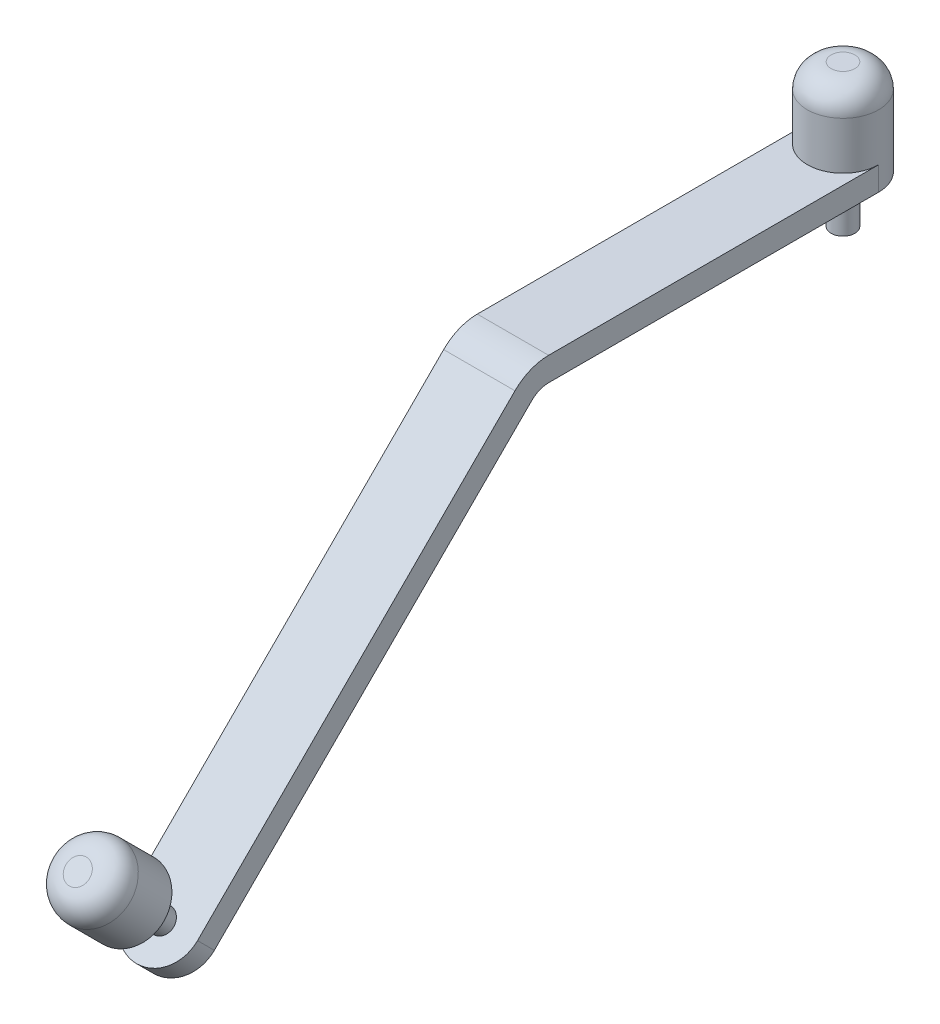
ISO-10303-21;
HEADER;
FILE_DESCRIPTION(('STEP AP214'),'2;1');
FILE_NAME('part.step','',(''),(''),'','','');
FILE_SCHEMA(('AUTOMOTIVE_DESIGN { 1 0 10303 214 1 1 1 1 }'));
ENDSEC;
DATA;
#1=APPLICATION_CONTEXT('core data for automotive mechanical design processes');
#2=APPLICATION_PROTOCOL_DEFINITION('international standard','automotive_design',2000,#1);
#3=PRODUCT_CONTEXT('',#1,'mechanical');
#4=PRODUCT('Part','Part','',(#3));
#5=PRODUCT_RELATED_PRODUCT_CATEGORY('part','',(#4));
#6=PRODUCT_DEFINITION_FORMATION('','',#4);
#7=PRODUCT_DEFINITION_CONTEXT('part definition',#1,'design');
#8=PRODUCT_DEFINITION('design','',#6,#7);
#9=PRODUCT_DEFINITION_SHAPE('','',#8);
#10=(LENGTH_UNIT() NAMED_UNIT(*) SI_UNIT(.MILLI.,.METRE.));
#11=(NAMED_UNIT(*) PLANE_ANGLE_UNIT() SI_UNIT($,.RADIAN.));
#12=(NAMED_UNIT(*) SI_UNIT($,.STERADIAN.) SOLID_ANGLE_UNIT());
#13=UNCERTAINTY_MEASURE_WITH_UNIT(LENGTH_MEASURE(1.E-05),#10,'distance_accuracy_value','');
#14=(GEOMETRIC_REPRESENTATION_CONTEXT(3) GLOBAL_UNCERTAINTY_ASSIGNED_CONTEXT((#13)) GLOBAL_UNIT_ASSIGNED_CONTEXT((#10,
#11,#12)) REPRESENTATION_CONTEXT('',''));
#15=CARTESIAN_POINT('',(0.,0.,0.));
#16=DIRECTION('',(0.,0.,1.));
#17=DIRECTION('',(1.,0.,0.));
#18=AXIS2_PLACEMENT_3D('',#15,#16,#17);
#19=CARTESIAN_POINT('',(30.,43.5355339059328,43.5355339059328));
#20=DIRECTION('',(0.,0.707106781186547,0.707106781186548));
#21=DIRECTION('',(0.,-0.707106781186548,0.707106781186547));
#22=AXIS2_PLACEMENT_3D('',#19,#20,#21);
#23=PLANE('',#22);
#24=CARTESIAN_POINT('',(15.,-134.350288425443,221.421356237308));
#25=DIRECTION('',(0.,0.707106781186547,0.707106781186548));
#26=DIRECTION('',(0.,-0.707106781186548,0.707106781186547));
#27=AXIS2_PLACEMENT_3D('',#24,#25,#26);
#28=CIRCLE('',#27,5.00000000000001);
#29=CARTESIAN_POINT('',(15.,-137.885822331375,224.956890143241));
#30=VERTEX_POINT('',#29);
#31=EDGE_CURVE('E130',#30,#30,#28,.T.);
#32=ORIENTED_EDGE('',*,*,#31,.F.);
#33=EDGE_LOOP('',(#32));
#34=FACE_BOUND('',#33,.T.);
#35=CARTESIAN_POINT('',(15.,-134.350288425443,221.421356237308));
#36=DIRECTION('',(0.,0.707106781186547,0.707106781186548));
#37=DIRECTION('',(0.,-0.707106781186548,0.707106781186547));
#38=AXIS2_PLACEMENT_3D('',#35,#36,#37);
#39=CIRCLE('',#38,15.);
#40=CARTESIAN_POINT('',(0.,-134.350288425443,221.421356237308));
#41=VERTEX_POINT('',#40);
#42=CARTESIAN_POINT('',(15.,-144.956890143241,232.027957955106));
#43=VERTEX_POINT('',#42);
#44=EDGE_CURVE('E436',#41,#43,#39,.T.);
#45=ORIENTED_EDGE('',*,*,#44,.T.);
#46=CARTESIAN_POINT('',(15.,-134.350288425443,221.421356237308));
#47=DIRECTION('',(0.,0.707106781186547,0.707106781186548));
#48=DIRECTION('',(0.,-0.707106781186548,0.707106781186547));
#49=AXIS2_PLACEMENT_3D('',#46,#47,#48);
#50=CIRCLE('',#49,15.);
#51=CARTESIAN_POINT('',(30.,-134.350288425443,221.421356237308));
#52=VERTEX_POINT('',#51);
#53=EDGE_CURVE('E438',#43,#52,#50,.T.);
#54=ORIENTED_EDGE('',*,*,#53,.T.);
#55=DIRECTION('',(0.,0.707106781186548,-0.707106781186547));
#56=VECTOR('',#55,1.);
#57=CARTESIAN_POINT('',(30.,43.5355339059328,43.5355339059328));
#58=LINE('',#57,#56);
#59=CARTESIAN_POINT('',(30.,-0.857864376269064,87.9289321881346));
#60=VERTEX_POINT('',#59);
#61=EDGE_CURVE('E390',#52,#60,#58,.T.);
#62=ORIENTED_EDGE('',*,*,#61,.T.);
#63=DIRECTION('',(-1.,0.,0.));
#64=VECTOR('',#63,1.);
#65=CARTESIAN_POINT('',(30.,-0.857864376269057,87.9289321881346));
#66=LINE('',#65,#64);
#67=CARTESIAN_POINT('',(0.,-0.857864376269064,87.9289321881346));
#68=VERTEX_POINT('',#67);
#69=EDGE_CURVE('E419',#60,#68,#66,.T.);
#70=ORIENTED_EDGE('',*,*,#69,.T.);
#71=DIRECTION('',(0.,0.707106781186548,-0.707106781186547));
#72=VECTOR('',#71,1.);
#73=CARTESIAN_POINT('',(0.,43.5355339059328,43.5355339059328));
#74=LINE('',#73,#72);
#75=EDGE_CURVE('E127',#41,#68,#74,.T.);
#76=ORIENTED_EDGE('',*,*,#75,.F.);
#77=EDGE_LOOP('',(#45,#54,#62,#70,#76));
#78=FACE_BOUND('',#77,.T.);
#79=ADVANCED_FACE('F41',(#34,#78),#23,.T.);
#80=CARTESIAN_POINT('',(30.,36.4644660940675,36.4644660940676));
#81=DIRECTION('',(0.,0.707106781186546,0.707106781186549));
#82=DIRECTION('',(0.,-0.707106781186549,0.707106781186546));
#83=AXIS2_PLACEMENT_3D('',#80,#81,#82);
#84=PLANE('',#83);
#85=DIRECTION('',(0.,0.707106781186549,-0.707106781186546));
#86=VECTOR('',#85,1.);
#87=CARTESIAN_POINT('',(30.,36.4644660940675,36.4644660940676));
#88=LINE('',#87,#86);
#89=CARTESIAN_POINT('',(30.,-141.421356237308,214.350288425443));
#90=VERTEX_POINT('',#89);
#91=CARTESIAN_POINT('',(30.,-7.92893218813455,80.8578643762695));
#92=VERTEX_POINT('',#91);
#93=EDGE_CURVE('E392',#90,#92,#88,.T.);
#94=ORIENTED_EDGE('',*,*,#93,.F.);
#95=CARTESIAN_POINT('',(15.,-141.421356237308,214.350288425443));
#96=DIRECTION('',(0.,0.707106781186546,0.707106781186549));
#97=DIRECTION('',(0.,-0.707106781186549,0.707106781186546));
#98=AXIS2_PLACEMENT_3D('',#95,#96,#97);
#99=CIRCLE('',#98,15.);
#100=CARTESIAN_POINT('',(15.,-152.027957955106,224.956890143241));
#101=VERTEX_POINT('',#100);
#102=EDGE_CURVE('E434',#90,#101,#99,.F.);
#103=ORIENTED_EDGE('',*,*,#102,.T.);
#104=CARTESIAN_POINT('',(15.,-141.421356237308,214.350288425443));
#105=DIRECTION('',(0.,0.707106781186546,0.707106781186549));
#106=DIRECTION('',(0.,-0.707106781186549,0.707106781186546));
#107=AXIS2_PLACEMENT_3D('',#104,#105,#106);
#108=CIRCLE('',#107,15.);
#109=CARTESIAN_POINT('',(0.,-141.421356237308,214.350288425443));
#110=VERTEX_POINT('',#109);
#111=EDGE_CURVE('E432',#101,#110,#108,.F.);
#112=ORIENTED_EDGE('',*,*,#111,.T.);
#113=DIRECTION('',(0.,0.707106781186549,-0.707106781186546));
#114=VECTOR('',#113,1.);
#115=CARTESIAN_POINT('',(0.,36.4644660940675,36.4644660940676));
#116=LINE('',#115,#114);
#117=CARTESIAN_POINT('',(0.,-7.92893218813455,80.8578643762695));
#118=VERTEX_POINT('',#117);
#119=EDGE_CURVE('E404',#110,#118,#116,.T.);
#120=ORIENTED_EDGE('',*,*,#119,.T.);
#121=DIRECTION('',(-1.,0.,0.));
#122=VECTOR('',#121,1.);
#123=CARTESIAN_POINT('',(30.,-7.92893218813454,80.8578643762695));
#124=LINE('',#123,#122);
#125=EDGE_CURVE('E411',#118,#92,#124,.F.);
#126=ORIENTED_EDGE('',*,*,#125,.T.);
#127=EDGE_LOOP('',(#94,#103,#112,#120,#126));
#128=FACE_BOUND('',#127,.T.);
#129=ADVANCED_FACE('F157',(#128),#84,.F.);
#130=CARTESIAN_POINT('',(30.,-5.,0.));
#131=DIRECTION('',(0.,1.,0.));
#132=DIRECTION('',(0.,0.,1.));
#133=AXIS2_PLACEMENT_3D('',#130,#131,#132);
#134=PLANE('',#133);
#135=CARTESIAN_POINT('',(15.,-5.,-65.));
#136=DIRECTION('',(0.,1.,0.));
#137=DIRECTION('',(0.,0.,1.));
#138=AXIS2_PLACEMENT_3D('',#135,#136,#137);
#139=CIRCLE('',#138,5.);
#140=CARTESIAN_POINT('',(15.,-5.,-60.));
#141=VERTEX_POINT('',#140);
#142=EDGE_CURVE('E141',#141,#141,#139,.F.);
#143=ORIENTED_EDGE('',*,*,#142,.F.);
#144=EDGE_LOOP('',(#143));
#145=FACE_BOUND('',#144,.T.);
#146=CARTESIAN_POINT('',(15.,-5.,-65.));
#147=DIRECTION('',(0.,1.,0.));
#148=DIRECTION('',(0.,0.,1.));
#149=AXIS2_PLACEMENT_3D('',#146,#147,#148);
#150=CIRCLE('',#149,15.);
#151=CARTESIAN_POINT('',(0.,-5.,-65.));
#152=VERTEX_POINT('',#151);
#153=CARTESIAN_POINT('',(15.,-5.,-80.));
#154=VERTEX_POINT('',#153);
#155=EDGE_CURVE('E56',#152,#154,#150,.F.);
#156=ORIENTED_EDGE('',*,*,#155,.T.);
#157=CARTESIAN_POINT('',(15.,-5.,-65.));
#158=DIRECTION('',(0.,1.,0.));
#159=DIRECTION('',(0.,0.,1.));
#160=AXIS2_PLACEMENT_3D('',#157,#158,#159);
#161=CIRCLE('',#160,15.);
#162=CARTESIAN_POINT('',(30.,-5.,-65.));
#163=VERTEX_POINT('',#162);
#164=EDGE_CURVE('E122',#154,#163,#161,.F.);
#165=ORIENTED_EDGE('',*,*,#164,.T.);
#166=DIRECTION('',(0.,0.,-1.));
#167=VECTOR('',#166,1.);
#168=CARTESIAN_POINT('',(30.,-5.,0.));
#169=LINE('',#168,#167);
#170=CARTESIAN_POINT('',(30.,-5.,73.786796564404));
#171=VERTEX_POINT('',#170);
#172=EDGE_CURVE('E395',#171,#163,#169,.T.);
#173=ORIENTED_EDGE('',*,*,#172,.F.);
#174=DIRECTION('',(-1.,0.,0.));
#175=VECTOR('',#174,1.);
#176=CARTESIAN_POINT('',(0.,-5.,73.786796564404));
#177=LINE('',#176,#175);
#178=CARTESIAN_POINT('',(0.,-5.,73.786796564404));
#179=VERTEX_POINT('',#178);
#180=EDGE_CURVE('E402',#171,#179,#177,.T.);
#181=ORIENTED_EDGE('',*,*,#180,.T.);
#182=DIRECTION('',(0.,0.,-1.));
#183=VECTOR('',#182,1.);
#184=CARTESIAN_POINT('',(0.,-5.,0.));
#185=LINE('',#184,#183);
#186=EDGE_CURVE('E406',#179,#152,#185,.T.);
#187=ORIENTED_EDGE('',*,*,#186,.T.);
#188=EDGE_LOOP('',(#156,#165,#173,#181,#187));
#189=FACE_BOUND('',#188,.T.);
#190=ADVANCED_FACE('F163',(#145,#189),#134,.F.);
#191=CARTESIAN_POINT('',(30.,5.,0.));
#192=DIRECTION('',(0.,1.,0.));
#193=DIRECTION('',(0.,0.,1.));
#194=AXIS2_PLACEMENT_3D('',#191,#192,#193);
#195=PLANE('',#194);
#196=DIRECTION('',(0.,0.,-1.));
#197=VECTOR('',#196,1.);
#198=CARTESIAN_POINT('',(30.,5.,0.));
#199=LINE('',#198,#197);
#200=CARTESIAN_POINT('',(30.,5.,73.7867965644036));
#201=VERTEX_POINT('',#200);
#202=CARTESIAN_POINT('',(30.,5.,-65.));
#203=VERTEX_POINT('',#202);
#204=EDGE_CURVE('E399',#201,#203,#199,.T.);
#205=ORIENTED_EDGE('',*,*,#204,.T.);
#206=CARTESIAN_POINT('',(15.,5.,-65.));
#207=DIRECTION('',(0.,1.,0.));
#208=DIRECTION('',(0.,0.,1.));
#209=AXIS2_PLACEMENT_3D('',#206,#207,#208);
#210=CIRCLE('',#209,15.);
#211=CARTESIAN_POINT('',(0.,5.,-65.));
#212=VERTEX_POINT('',#211);
#213=EDGE_CURVE('E381',#212,#203,#210,.T.);
#214=ORIENTED_EDGE('',*,*,#213,.F.);
#215=DIRECTION('',(0.,0.,-1.));
#216=VECTOR('',#215,1.);
#217=CARTESIAN_POINT('',(0.,5.,0.));
#218=LINE('',#217,#216);
#219=CARTESIAN_POINT('',(0.,5.,73.7867965644036));
#220=VERTEX_POINT('',#219);
#221=EDGE_CURVE('E393',#220,#212,#218,.T.);
#222=ORIENTED_EDGE('',*,*,#221,.F.);
#223=DIRECTION('',(-1.,0.,0.));
#224=VECTOR('',#223,1.);
#225=CARTESIAN_POINT('',(30.,5.,73.7867965644036));
#226=LINE('',#225,#224);
#227=EDGE_CURVE('E424',#220,#201,#226,.F.);
#228=ORIENTED_EDGE('',*,*,#227,.T.);
#229=EDGE_LOOP('',(#205,#214,#222,#228));
#230=FACE_BOUND('',#229,.T.);
#231=ADVANCED_FACE('F224',(#230),#195,.T.);
#232=CARTESIAN_POINT('',(30.,0.,0.));
#233=DIRECTION('',(1.,0.,0.));
#234=DIRECTION('',(0.,0.,-1.));
#235=AXIS2_PLACEMENT_3D('',#232,#233,#234);
#236=PLANE('',#235);
#237=ORIENTED_EDGE('',*,*,#172,.T.);
#238=DIRECTION('',(0.,1.,0.));
#239=VECTOR('',#238,1.);
#240=CARTESIAN_POINT('',(30.,5.,-65.));
#241=LINE('',#240,#239);
#242=EDGE_CURVE('E441',#163,#203,#241,.T.);
#243=ORIENTED_EDGE('',*,*,#242,.T.);
#244=ORIENTED_EDGE('',*,*,#204,.F.);
#245=CARTESIAN_POINT('',(30.,-15.,73.7867965644036));
#246=DIRECTION('',(1.,0.,0.));
#247=DIRECTION('',(0.,0.,-1.));
#248=AXIS2_PLACEMENT_3D('',#245,#246,#247);
#249=CIRCLE('',#248,20.);
#250=EDGE_CURVE('E426',#201,#60,#249,.T.);
#251=ORIENTED_EDGE('',*,*,#250,.T.);
#252=ORIENTED_EDGE('',*,*,#61,.F.);
#253=DIRECTION('',(0.,-0.707106781186545,-0.70710678118655));
#254=VECTOR('',#253,1.);
#255=CARTESIAN_POINT('',(30.,-141.421356237308,214.350288425443));
#256=LINE('',#255,#254);
#257=EDGE_CURVE('E429',#52,#90,#256,.T.);
#258=ORIENTED_EDGE('',*,*,#257,.T.);
#259=ORIENTED_EDGE('',*,*,#93,.T.);
#260=CARTESIAN_POINT('',(30.,-15.,73.786796564404));
#261=DIRECTION('',(1.,0.,0.));
#262=DIRECTION('',(0.,0.,-1.));
#263=AXIS2_PLACEMENT_3D('',#260,#261,#262);
#264=CIRCLE('',#263,10.);
#265=EDGE_CURVE('E417',#92,#171,#264,.F.);
#266=ORIENTED_EDGE('',*,*,#265,.T.);
#267=EDGE_LOOP('',(#237,#243,#244,#251,#252,#258,#259,#266));
#268=FACE_BOUND('',#267,.T.);
#269=ADVANCED_FACE('F221',(#268),#236,.T.);
#270=CARTESIAN_POINT('',(0.,0.,0.));
#271=DIRECTION('',(1.,0.,0.));
#272=DIRECTION('',(0.,0.,-1.));
#273=AXIS2_PLACEMENT_3D('',#270,#271,#272);
#274=PLANE('',#273);
#275=ORIENTED_EDGE('',*,*,#221,.T.);
#276=DIRECTION('',(0.,1.,0.));
#277=VECTOR('',#276,1.);
#278=CARTESIAN_POINT('',(0.,0.,-65.));
#279=LINE('',#278,#277);
#280=EDGE_CURVE('E64',#212,#152,#279,.F.);
#281=ORIENTED_EDGE('',*,*,#280,.T.);
#282=ORIENTED_EDGE('',*,*,#186,.F.);
#283=CARTESIAN_POINT('',(0.,-15.,73.786796564404));
#284=DIRECTION('',(1.,0.,0.));
#285=DIRECTION('',(0.,0.,-1.));
#286=AXIS2_PLACEMENT_3D('',#283,#284,#285);
#287=CIRCLE('',#286,10.);
#288=EDGE_CURVE('E414',#179,#118,#287,.T.);
#289=ORIENTED_EDGE('',*,*,#288,.T.);
#290=ORIENTED_EDGE('',*,*,#119,.F.);
#291=DIRECTION('',(0.,-0.707106781186545,-0.70710678118655));
#292=VECTOR('',#291,1.);
#293=CARTESIAN_POINT('',(0.,-177.885822331376,177.885822331374));
#294=LINE('',#293,#292);
#295=EDGE_CURVE('E440',#110,#41,#294,.F.);
#296=ORIENTED_EDGE('',*,*,#295,.T.);
#297=ORIENTED_EDGE('',*,*,#75,.T.);
#298=CARTESIAN_POINT('',(0.,-15.,73.7867965644036));
#299=DIRECTION('',(1.,0.,0.));
#300=DIRECTION('',(0.,0.,-1.));
#301=AXIS2_PLACEMENT_3D('',#298,#299,#300);
#302=CIRCLE('',#301,20.);
#303=EDGE_CURVE('E422',#68,#220,#302,.F.);
#304=ORIENTED_EDGE('',*,*,#303,.T.);
#305=EDGE_LOOP('',(#275,#281,#282,#289,#290,#296,#297,#304));
#306=FACE_BOUND('',#305,.T.);
#307=ADVANCED_FACE('F174',(#306),#274,.F.);
#308=CARTESIAN_POINT('',(30.,-15.,73.786796564404));
#309=DIRECTION('',(1.,0.,0.));
#310=DIRECTION('',(0.,0.,-1.));
#311=AXIS2_PLACEMENT_3D('',#308,#309,#310);
#312=CYLINDRICAL_SURFACE('',#311,10.);
#313=ORIENTED_EDGE('',*,*,#265,.F.);
#314=ORIENTED_EDGE('',*,*,#125,.F.);
#315=ORIENTED_EDGE('',*,*,#288,.F.);
#316=ORIENTED_EDGE('',*,*,#180,.F.);
#317=EDGE_LOOP('',(#313,#314,#315,#316));
#318=FACE_BOUND('',#317,.T.);
#319=ADVANCED_FACE('F170',(#318),#312,.F.);
#320=CARTESIAN_POINT('',(30.,-15.,73.7867965644036));
#321=DIRECTION('',(-1.,0.,0.));
#322=DIRECTION('',(0.,0.,1.));
#323=AXIS2_PLACEMENT_3D('',#320,#321,#322);
#324=CYLINDRICAL_SURFACE('',#323,20.);
#325=ORIENTED_EDGE('',*,*,#250,.F.);
#326=ORIENTED_EDGE('',*,*,#227,.F.);
#327=ORIENTED_EDGE('',*,*,#303,.F.);
#328=ORIENTED_EDGE('',*,*,#69,.F.);
#329=EDGE_LOOP('',(#325,#326,#327,#328));
#330=FACE_BOUND('',#329,.T.);
#331=ADVANCED_FACE('F173',(#330),#324,.T.);
#332=CARTESIAN_POINT('',(15.,-177.885822331376,177.885822331374));
#333=DIRECTION('',(0.,-0.707106781186545,-0.70710678118655));
#334=DIRECTION('',(0.,0.70710678118655,-0.707106781186545));
#335=AXIS2_PLACEMENT_3D('',#332,#333,#334);
#336=CYLINDRICAL_SURFACE('',#335,15.);
#337=DIRECTION('',(0.,-0.707106781186545,-0.70710678118655));
#338=VECTOR('',#337,1.);
#339=CARTESIAN_POINT('',(15.,-188.492424049174,188.492424049173));
#340=LINE('',#339,#338);
#341=EDGE_CURVE('E123',#43,#101,#340,.T.);
#342=ORIENTED_EDGE('',*,*,#341,.F.);
#343=ORIENTED_EDGE('',*,*,#44,.F.);
#344=ORIENTED_EDGE('',*,*,#295,.F.);
#345=ORIENTED_EDGE('',*,*,#111,.F.);
#346=EDGE_LOOP('',(#342,#343,#344,#345));
#347=FACE_BOUND('',#346,.T.);
#348=ADVANCED_FACE('F178',(#347),#336,.T.);
#349=CARTESIAN_POINT('',(15.,-177.885822331376,177.885822331374));
#350=DIRECTION('',(0.,0.707106781186545,0.70710678118655));
#351=DIRECTION('',(0.,-0.70710678118655,0.707106781186545));
#352=AXIS2_PLACEMENT_3D('',#349,#350,#351);
#353=CYLINDRICAL_SURFACE('',#352,15.);
#354=ORIENTED_EDGE('',*,*,#53,.F.);
#355=ORIENTED_EDGE('',*,*,#341,.T.);
#356=ORIENTED_EDGE('',*,*,#102,.F.);
#357=ORIENTED_EDGE('',*,*,#257,.F.);
#358=EDGE_LOOP('',(#354,#355,#356,#357));
#359=FACE_BOUND('',#358,.T.);
#360=ADVANCED_FACE('F180',(#359),#353,.T.);
#361=CARTESIAN_POINT('',(15.,0.,-65.));
#362=DIRECTION('',(0.,1.,0.));
#363=DIRECTION('',(0.,0.,1.));
#364=AXIS2_PLACEMENT_3D('',#361,#362,#363);
#365=CYLINDRICAL_SURFACE('',#364,15.);
#366=CARTESIAN_POINT('',(15.,25.,-65.));
#367=DIRECTION('',(0.,1.,0.));
#368=DIRECTION('',(0.,0.,1.));
#369=AXIS2_PLACEMENT_3D('',#366,#367,#368);
#370=CIRCLE('',#369,15.);
#371=CARTESIAN_POINT('',(15.,25.,-50.));
#372=VERTEX_POINT('',#371);
#373=EDGE_CURVE('E11',#372,#372,#370,.F.);
#374=ORIENTED_EDGE('',*,*,#373,.T.);
#375=EDGE_LOOP('',(#374));
#376=FACE_BOUND('',#375,.T.);
#377=DIRECTION('',(0.,1.,0.));
#378=VECTOR('',#377,1.);
#379=CARTESIAN_POINT('',(15.,0.,-80.));
#380=LINE('',#379,#378);
#381=CARTESIAN_POINT('',(15.,5.,-80.));
#382=VERTEX_POINT('',#381);
#383=EDGE_CURVE('E119',#154,#382,#380,.T.);
#384=ORIENTED_EDGE('',*,*,#383,.F.);
#385=ORIENTED_EDGE('',*,*,#155,.F.);
#386=ORIENTED_EDGE('',*,*,#280,.F.);
#387=ORIENTED_EDGE('',*,*,#213,.T.);
#388=ORIENTED_EDGE('',*,*,#242,.F.);
#389=ORIENTED_EDGE('',*,*,#164,.F.);
#390=ORIENTED_EDGE('',*,*,#383,.T.);
#391=EDGE_LOOP('',(#384,#385,#386,#387,#388,#389,#390));
#392=FACE_BOUND('',#391,.T.);
#393=ADVANCED_FACE('F120',(#376,#392),#365,.T.);
#394=CARTESIAN_POINT('',(15.,-120.208152801712,235.563491861039));
#395=DIRECTION('',(0.,-0.707106781186547,-0.707106781186548));
#396=DIRECTION('',(0.,0.707106781186548,-0.707106781186547));
#397=AXIS2_PLACEMENT_3D('',#394,#395,#396);
#398=CYLINDRICAL_SURFACE('',#397,5.00000000000001);
#399=CARTESIAN_POINT('',(15.,-120.208152801712,235.563491861039));
#400=DIRECTION('',(0.,0.707106781186547,0.707106781186548));
#401=DIRECTION('',(0.,-0.707106781186548,0.707106781186547));
#402=AXIS2_PLACEMENT_3D('',#399,#400,#401);
#403=CIRCLE('',#402,5.00000000000001);
#404=CARTESIAN_POINT('',(15.,-123.743686707644,239.099025766972));
#405=VERTEX_POINT('',#404);
#406=EDGE_CURVE('E124',#405,#405,#403,.T.);
#407=ORIENTED_EDGE('',*,*,#406,.F.);
#408=EDGE_LOOP('',(#407));
#409=FACE_BOUND('',#408,.T.);
#410=ORIENTED_EDGE('',*,*,#31,.T.);
#411=EDGE_LOOP('',(#410));
#412=FACE_BOUND('',#411,.T.);
#413=ADVANCED_FACE('F188',(#409,#412),#398,.T.);
#414=CARTESIAN_POINT('',(15.,-98.9949493661153,256.776695296635));
#415=DIRECTION('',(0.,-0.707106781186547,-0.707106781186548));
#416=DIRECTION('',(0.,0.707106781186548,-0.707106781186547));
#417=AXIS2_PLACEMENT_3D('',#414,#415,#416);
#418=CYLINDRICAL_SURFACE('',#417,15.);
#419=CARTESIAN_POINT('',(15.,-106.066017177981,249.70562748477));
#420=DIRECTION('',(0.,0.707106781186547,0.707106781186548));
#421=DIRECTION('',(0.,-0.707106781186548,0.707106781186547));
#422=AXIS2_PLACEMENT_3D('',#419,#420,#421);
#423=CIRCLE('',#422,15.);
#424=CARTESIAN_POINT('',(15.,-116.672618895779,260.312229202568));
#425=VERTEX_POINT('',#424);
#426=EDGE_CURVE('E138',#425,#425,#423,.F.);
#427=ORIENTED_EDGE('',*,*,#426,.T.);
#428=EDGE_LOOP('',(#427));
#429=FACE_BOUND('',#428,.T.);
#430=CARTESIAN_POINT('',(15.,-120.208152801712,235.563491861039));
#431=DIRECTION('',(0.,0.707106781186547,0.707106781186548));
#432=DIRECTION('',(0.,-0.707106781186548,0.707106781186547));
#433=AXIS2_PLACEMENT_3D('',#430,#431,#432);
#434=CIRCLE('',#433,15.);
#435=CARTESIAN_POINT('',(15.,-130.81475451951,246.170093578837));
#436=VERTEX_POINT('',#435);
#437=EDGE_CURVE('E380',#436,#436,#434,.T.);
#438=ORIENTED_EDGE('',*,*,#437,.T.);
#439=EDGE_LOOP('',(#438));
#440=FACE_BOUND('',#439,.T.);
#441=ADVANCED_FACE('F209',(#429,#440),#418,.T.);
#442=CARTESIAN_POINT('',(15.,-98.9949493661153,256.776695296635));
#443=DIRECTION('',(0.,0.707106781186547,0.707106781186548));
#444=DIRECTION('',(0.,-0.707106781186548,0.707106781186547));
#445=AXIS2_PLACEMENT_3D('',#442,#443,#444);
#446=PLANE('',#445);
#447=CARTESIAN_POINT('',(15.,-98.9949493661153,256.776695296635));
#448=DIRECTION('',(0.,0.707106781186547,0.707106781186548));
#449=DIRECTION('',(0.,-0.707106781186548,0.707106781186547));
#450=AXIS2_PLACEMENT_3D('',#447,#448,#449);
#451=CIRCLE('',#450,4.99999999999997);
#452=CARTESIAN_POINT('',(15.,-102.530483272048,260.312229202568));
#453=VERTEX_POINT('',#452);
#454=EDGE_CURVE('E135',#453,#453,#451,.T.);
#455=ORIENTED_EDGE('',*,*,#454,.T.);
#456=EDGE_LOOP('',(#455));
#457=FACE_BOUND('',#456,.T.);
#458=ADVANCED_FACE('F201',(#457),#446,.T.);
#459=CARTESIAN_POINT('',(15.,-120.208152801712,235.563491861039));
#460=DIRECTION('',(0.,0.707106781186547,0.707106781186548));
#461=DIRECTION('',(0.,-0.707106781186548,0.707106781186547));
#462=AXIS2_PLACEMENT_3D('',#459,#460,#461);
#463=PLANE('',#462);
#464=ORIENTED_EDGE('',*,*,#406,.T.);
#465=EDGE_LOOP('',(#464));
#466=FACE_BOUND('',#465,.T.);
#467=ORIENTED_EDGE('',*,*,#437,.F.);
#468=EDGE_LOOP('',(#467));
#469=FACE_BOUND('',#468,.T.);
#470=ADVANCED_FACE('F193',(#466,#469),#463,.F.);
#471=CARTESIAN_POINT('',(15.,-106.066017177981,249.70562748477));
#472=DIRECTION('',(0.,0.707106781186547,0.707106781186548));
#473=DIRECTION('',(0.,-0.707106781186548,0.707106781186547));
#474=AXIS2_PLACEMENT_3D('',#471,#472,#473);
#475=DEGENERATE_TOROIDAL_SURFACE('',#474,4.99999999999997,10.,.T.);
#476=ORIENTED_EDGE('',*,*,#426,.F.);
#477=EDGE_LOOP('',(#476));
#478=FACE_BOUND('',#477,.T.);
#479=ORIENTED_EDGE('',*,*,#454,.F.);
#480=EDGE_LOOP('',(#479));
#481=FACE_BOUND('',#480,.T.);
#482=ADVANCED_FACE('F190',(#478,#481),#475,.T.);
#483=CARTESIAN_POINT('',(15.,-25.,-65.));
#484=DIRECTION('',(0.,1.,0.));
#485=DIRECTION('',(0.,0.,1.));
#486=AXIS2_PLACEMENT_3D('',#483,#484,#485);
#487=CYLINDRICAL_SURFACE('',#486,5.);
#488=CARTESIAN_POINT('',(15.,-25.,-65.));
#489=DIRECTION('',(0.,-1.,0.));
#490=DIRECTION('',(0.,0.,-1.));
#491=AXIS2_PLACEMENT_3D('',#488,#489,#490);
#492=CIRCLE('',#491,5.);
#493=CARTESIAN_POINT('',(15.,-25.,-70.));
#494=VERTEX_POINT('',#493);
#495=EDGE_CURVE('E379',#494,#494,#492,.T.);
#496=ORIENTED_EDGE('',*,*,#495,.F.);
#497=EDGE_LOOP('',(#496));
#498=FACE_BOUND('',#497,.T.);
#499=ORIENTED_EDGE('',*,*,#142,.T.);
#500=EDGE_LOOP('',(#499));
#501=FACE_BOUND('',#500,.T.);
#502=ADVANCED_FACE('F192',(#498,#501),#487,.T.);
#503=CARTESIAN_POINT('',(15.,-25.,-65.));
#504=DIRECTION('',(0.,-1.,0.));
#505=DIRECTION('',(0.,0.,-1.));
#506=AXIS2_PLACEMENT_3D('',#503,#504,#505);
#507=PLANE('',#506);
#508=ORIENTED_EDGE('',*,*,#495,.T.);
#509=EDGE_LOOP('',(#508));
#510=FACE_BOUND('',#509,.T.);
#511=ADVANCED_FACE('F153',(#510),#507,.T.);
#512=CARTESIAN_POINT('',(15.,35.,-65.));
#513=DIRECTION('',(0.,1.,0.));
#514=DIRECTION('',(0.,0.,1.));
#515=AXIS2_PLACEMENT_3D('',#512,#513,#514);
#516=PLANE('',#515);
#517=CARTESIAN_POINT('',(15.,35.,-65.));
#518=DIRECTION('',(0.,1.,0.));
#519=DIRECTION('',(0.,0.,1.));
#520=AXIS2_PLACEMENT_3D('',#517,#518,#519);
#521=CIRCLE('',#520,5.);
#522=CARTESIAN_POINT('',(15.,35.,-60.));
#523=VERTEX_POINT('',#522);
#524=EDGE_CURVE('E49',#523,#523,#521,.T.);
#525=ORIENTED_EDGE('',*,*,#524,.T.);
#526=EDGE_LOOP('',(#525));
#527=FACE_BOUND('',#526,.T.);
#528=ADVANCED_FACE('F146',(#527),#516,.T.);
#529=CARTESIAN_POINT('',(15.,25.,-65.));
#530=DIRECTION('',(0.,1.,0.));
#531=DIRECTION('',(0.,0.,1.));
#532=AXIS2_PLACEMENT_3D('',#529,#530,#531);
#533=DEGENERATE_TOROIDAL_SURFACE('',#532,5.,10.,.T.);
#534=ORIENTED_EDGE('',*,*,#373,.F.);
#535=EDGE_LOOP('',(#534));
#536=FACE_BOUND('',#535,.T.);
#537=ORIENTED_EDGE('',*,*,#524,.F.);
#538=EDGE_LOOP('',(#537));
#539=FACE_BOUND('',#538,.T.);
#540=ADVANCED_FACE('F43',(#536,#539),#533,.T.);
#541=CLOSED_SHELL('',(#79,#129,#190,#231,#269,#307,#319,#331,#348,#360,#393,#413,#441,#458,#470,
#482,#502,#511,#528,#540));
#542=MANIFOLD_SOLID_BREP('B2',#541);
#543=ADVANCED_BREP_SHAPE_REPRESENTATION('',(#18,#542),#14);
#544=SHAPE_DEFINITION_REPRESENTATION(#9,#543);
ENDSEC;
END-ISO-10303-21;
